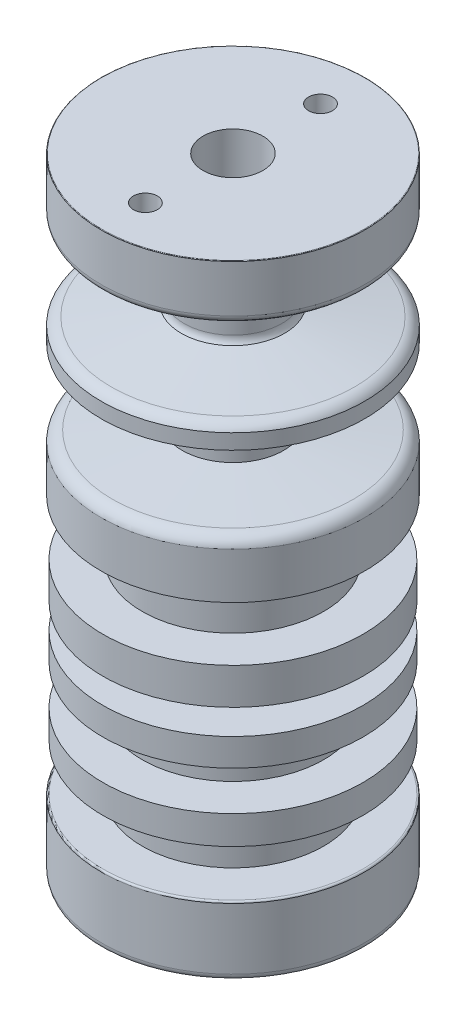
ISO-10303-21;
HEADER;
FILE_DESCRIPTION(('STEP AP214'),'2;1');
FILE_NAME('part.step','',(''),(''),'','','');
FILE_SCHEMA(('AUTOMOTIVE_DESIGN { 1 0 10303 214 1 1 1 1 }'));
ENDSEC;
DATA;
#1=APPLICATION_CONTEXT('core data for automotive mechanical design processes');
#2=APPLICATION_PROTOCOL_DEFINITION('international standard','automotive_design',2000,#1);
#3=PRODUCT_CONTEXT('',#1,'mechanical');
#4=PRODUCT('Part','Part','',(#3));
#5=PRODUCT_RELATED_PRODUCT_CATEGORY('part','',(#4));
#6=PRODUCT_DEFINITION_FORMATION('','',#4);
#7=PRODUCT_DEFINITION_CONTEXT('part definition',#1,'design');
#8=PRODUCT_DEFINITION('design','',#6,#7);
#9=PRODUCT_DEFINITION_SHAPE('','',#8);
#10=(LENGTH_UNIT() NAMED_UNIT(*) SI_UNIT(.MILLI.,.METRE.));
#11=(NAMED_UNIT(*) PLANE_ANGLE_UNIT() SI_UNIT($,.RADIAN.));
#12=(NAMED_UNIT(*) SI_UNIT($,.STERADIAN.) SOLID_ANGLE_UNIT());
#13=UNCERTAINTY_MEASURE_WITH_UNIT(LENGTH_MEASURE(1.E-05),#10,'distance_accuracy_value','');
#14=(GEOMETRIC_REPRESENTATION_CONTEXT(3) GLOBAL_UNCERTAINTY_ASSIGNED_CONTEXT((#13)) GLOBAL_UNIT_ASSIGNED_CONTEXT((#10,
#11,#12)) REPRESENTATION_CONTEXT('',''));
#15=CARTESIAN_POINT('',(0.,0.,0.));
#16=DIRECTION('',(0.,0.,1.));
#17=DIRECTION('',(1.,0.,0.));
#18=AXIS2_PLACEMENT_3D('',#15,#16,#17);
#19=CARTESIAN_POINT('',(0.,43.0445682451364,0.));
#20=DIRECTION('',(0.,-1.,0.));
#21=DIRECTION('',(1.,0.,0.));
#22=AXIS2_PLACEMENT_3D('',#19,#20,#21);
#23=PLANE('',#22);
#24=CARTESIAN_POINT('',(0.,43.0445682451364,0.));
#25=DIRECTION('',(0.,1.,0.));
#26=DIRECTION('',(0.,0.,1.));
#27=AXIS2_PLACEMENT_3D('',#24,#25,#26);
#28=CIRCLE('',#27,7.9375);
#29=CARTESIAN_POINT('',(0.,43.0445682451364,7.9375));
#30=VERTEX_POINT('',#29);
#31=EDGE_CURVE('E157',#30,#30,#28,.T.);
#32=ORIENTED_EDGE('',*,*,#31,.F.);
#33=EDGE_LOOP('',(#32));
#34=FACE_BOUND('',#33,.T.);
#35=CARTESIAN_POINT('',(0.244873021628365,43.0445682451364,-23.));
#36=DIRECTION('',(0.,1.,0.));
#37=DIRECTION('',(0.,0.,1.));
#38=AXIS2_PLACEMENT_3D('',#35,#36,#37);
#39=CIRCLE('',#38,3.175);
#40=CARTESIAN_POINT('',(0.244873021628365,43.0445682451364,-19.825));
#41=VERTEX_POINT('',#40);
#42=EDGE_CURVE('E148',#41,#41,#39,.T.);
#43=ORIENTED_EDGE('',*,*,#42,.F.);
#44=EDGE_LOOP('',(#43));
#45=FACE_BOUND('',#44,.T.);
#46=CARTESIAN_POINT('',(-0.244873021628365,43.0445682451364,23.));
#47=DIRECTION('',(0.,1.,0.));
#48=DIRECTION('',(0.,0.,1.));
#49=AXIS2_PLACEMENT_3D('',#46,#47,#48);
#50=CIRCLE('',#49,3.175);
#51=CARTESIAN_POINT('',(-0.244873021628365,43.0445682451364,26.175));
#52=VERTEX_POINT('',#51);
#53=EDGE_CURVE('E142',#52,#52,#50,.T.);
#54=ORIENTED_EDGE('',*,*,#53,.F.);
#55=EDGE_LOOP('',(#54));
#56=FACE_BOUND('',#55,.T.);
#57=CARTESIAN_POINT('',(0.,43.0445682451364,0.));
#58=DIRECTION('',(0.,1.,0.));
#59=DIRECTION('',(-1.,0.,0.));
#60=AXIS2_PLACEMENT_3D('',#57,#58,#59);
#61=CIRCLE('',#60,34.8584196821975);
#62=CARTESIAN_POINT('',(-34.8584196821975,43.0445682451364,0.));
#63=VERTEX_POINT('',#62);
#64=EDGE_CURVE('E10',#63,#63,#61,.T.);
#65=ORIENTED_EDGE('',*,*,#64,.T.);
#66=EDGE_LOOP('',(#65));
#67=FACE_BOUND('',#66,.T.);
#68=ADVANCED_FACE('F31',(#34,#45,#56,#67),#23,.F.);
#69=CARTESIAN_POINT('',(0.,42.9029879273339,0.));
#70=DIRECTION('',(0.,1.,0.));
#71=DIRECTION('',(-1.,0.,0.));
#72=AXIS2_PLACEMENT_3D('',#69,#70,#71);
#73=TOROIDAL_SURFACE('',#72,34.8584196821975,0.141580317802481);
#74=ORIENTED_EDGE('',*,*,#64,.F.);
#75=EDGE_LOOP('',(#74));
#76=FACE_BOUND('',#75,.T.);
#77=CARTESIAN_POINT('',(0.,42.9029879273339,0.));
#78=DIRECTION('',(0.,1.,0.));
#79=DIRECTION('',(-1.,0.,0.));
#80=AXIS2_PLACEMENT_3D('',#77,#78,#79);
#81=CIRCLE('',#80,35.);
#82=CARTESIAN_POINT('',(-35.,42.9029879273339,0.));
#83=VERTEX_POINT('',#82);
#84=EDGE_CURVE('E42',#83,#83,#81,.T.);
#85=ORIENTED_EDGE('',*,*,#84,.T.);
#86=EDGE_LOOP('',(#85));
#87=FACE_BOUND('',#86,.T.);
#88=ADVANCED_FACE('F174',(#76,#87),#73,.T.);
#89=CARTESIAN_POINT('',(0.,43.0445682451364,0.));
#90=DIRECTION('',(0.,1.,0.));
#91=DIRECTION('',(-1.,0.,0.));
#92=AXIS2_PLACEMENT_3D('',#89,#90,#91);
#93=CYLINDRICAL_SURFACE('',#92,35.);
#94=ORIENTED_EDGE('',*,*,#84,.F.);
#95=EDGE_LOOP('',(#94));
#96=FACE_BOUND('',#95,.T.);
#97=CARTESIAN_POINT('',(0.,30.3660149299546,0.));
#98=DIRECTION('',(0.,1.,0.));
#99=DIRECTION('',(-1.,0.,0.));
#100=AXIS2_PLACEMENT_3D('',#97,#98,#99);
#101=CIRCLE('',#100,35.);
#102=CARTESIAN_POINT('',(-35.,30.3660149299546,0.));
#103=VERTEX_POINT('',#102);
#104=EDGE_CURVE('E46',#103,#103,#101,.T.);
#105=ORIENTED_EDGE('',*,*,#104,.T.);
#106=EDGE_LOOP('',(#105));
#107=FACE_BOUND('',#106,.T.);
#108=ADVANCED_FACE('F316',(#96,#107),#93,.T.);
#109=CARTESIAN_POINT('',(0.,30.3660149299546,0.));
#110=DIRECTION('',(0.,1.,0.));
#111=DIRECTION('',(-1.,0.,0.));
#112=AXIS2_PLACEMENT_3D('',#109,#110,#111);
#113=TOROIDAL_SURFACE('',#112,32.9643531045201,2.03564689547988);
#114=ORIENTED_EDGE('',*,*,#104,.F.);
#115=EDGE_LOOP('',(#114));
#116=FACE_BOUND('',#115,.T.);
#117=CARTESIAN_POINT('',(0.,28.3303680344748,0.));
#118=DIRECTION('',(0.,1.,0.));
#119=DIRECTION('',(-1.,0.,0.));
#120=AXIS2_PLACEMENT_3D('',#117,#118,#119);
#121=CIRCLE('',#120,32.9643531045201);
#122=CARTESIAN_POINT('',(-32.9643531045201,28.3303680344747,0.));
#123=VERTEX_POINT('',#122);
#124=EDGE_CURVE('E51',#123,#123,#121,.T.);
#125=ORIENTED_EDGE('',*,*,#124,.T.);
#126=EDGE_LOOP('',(#125));
#127=FACE_BOUND('',#126,.T.);
#128=ADVANCED_FACE('F312',(#116,#127),#113,.T.);
#129=CARTESIAN_POINT('',(32.9643531045201,28.3303680344748,0.));
#130=DIRECTION('',(0.,1.,0.));
#131=DIRECTION('',(-1.,0.,0.));
#132=AXIS2_PLACEMENT_3D('',#129,#130,#131);
#133=PLANE('',#132);
#134=ORIENTED_EDGE('',*,*,#124,.F.);
#135=EDGE_LOOP('',(#134));
#136=FACE_BOUND('',#135,.T.);
#137=CARTESIAN_POINT('',(0.,28.3303680344748,0.));
#138=DIRECTION('',(0.,1.,0.));
#139=DIRECTION('',(-1.,0.,0.));
#140=AXIS2_PLACEMENT_3D('',#137,#138,#139);
#141=CIRCLE('',#140,12.9857969124329);
#142=CARTESIAN_POINT('',(-12.9857969124329,28.3303680344748,0.));
#143=VERTEX_POINT('',#142);
#144=EDGE_CURVE('E54',#143,#143,#141,.T.);
#145=ORIENTED_EDGE('',*,*,#144,.T.);
#146=EDGE_LOOP('',(#145));
#147=FACE_BOUND('',#146,.T.);
#148=ADVANCED_FACE('F308',(#136,#147),#133,.F.);
#149=CARTESIAN_POINT('',(0.,43.0445682451364,0.));
#150=DIRECTION('',(0.,1.,0.));
#151=DIRECTION('',(-1.,0.,0.));
#152=AXIS2_PLACEMENT_3D('',#149,#150,#151);
#153=CYLINDRICAL_SURFACE('',#152,12.9857969124329);
#154=ORIENTED_EDGE('',*,*,#144,.F.);
#155=EDGE_LOOP('',(#154));
#156=FACE_BOUND('',#155,.T.);
#157=CARTESIAN_POINT('',(0.,10.4062076007876,0.));
#158=DIRECTION('',(0.,1.,0.));
#159=DIRECTION('',(-1.,0.,0.));
#160=AXIS2_PLACEMENT_3D('',#157,#158,#159);
#161=CIRCLE('',#160,12.9857969124329);
#162=CARTESIAN_POINT('',(-12.9857969124329,10.4062076007876,0.));
#163=VERTEX_POINT('',#162);
#164=EDGE_CURVE('E57',#163,#163,#161,.T.);
#165=ORIENTED_EDGE('',*,*,#164,.T.);
#166=EDGE_LOOP('',(#165));
#167=FACE_BOUND('',#166,.T.);
#168=ADVANCED_FACE('F304',(#156,#167),#153,.T.);
#169=CARTESIAN_POINT('',(0.,10.4062076007876,0.));
#170=DIRECTION('',(0.,1.,0.));
#171=DIRECTION('',(-1.,0.,0.));
#172=AXIS2_PLACEMENT_3D('',#169,#170,#171);
#173=TOROIDAL_SURFACE('',#172,15.8008154382432,2.81501852581031);
#174=ORIENTED_EDGE('',*,*,#164,.F.);
#175=EDGE_LOOP('',(#174));
#176=FACE_BOUND('',#175,.T.);
#177=CARTESIAN_POINT('',(0.,8.51251271153448,0.));
#178=DIRECTION('',(0.,1.,0.));
#179=DIRECTION('',(-1.,0.,0.));
#180=AXIS2_PLACEMENT_3D('',#177,#178,#179);
#181=CIRCLE('',#180,13.7179690763931);
#182=CARTESIAN_POINT('',(-13.7179690763931,8.51251271153447,0.));
#183=VERTEX_POINT('',#182);
#184=EDGE_CURVE('E60',#183,#183,#181,.T.);
#185=ORIENTED_EDGE('',*,*,#184,.T.);
#186=EDGE_LOOP('',(#185));
#187=FACE_BOUND('',#186,.T.);
#188=ADVANCED_FACE('F300',(#176,#187),#173,.F.);
#189=CARTESIAN_POINT('',(0.,5.48596194522862,0.));
#190=DIRECTION('',(0.,-1.,0.));
#191=DIRECTION('',(1.,0.,0.));
#192=AXIS2_PLACEMENT_3D('',#189,#190,#191);
#193=CONICAL_SURFACE('',#192,32.3097448153254,1.40942212691776);
#194=ORIENTED_EDGE('',*,*,#184,.F.);
#195=EDGE_LOOP('',(#194));
#196=FACE_BOUND('',#195,.T.);
#197=CARTESIAN_POINT('',(0.,5.48596194522862,0.));
#198=DIRECTION('',(0.,1.,0.));
#199=DIRECTION('',(-1.,0.,0.));
#200=AXIS2_PLACEMENT_3D('',#197,#198,#199);
#201=CIRCLE('',#200,32.3097448153254);
#202=CARTESIAN_POINT('',(-32.3097448153254,5.48596194522862,0.));
#203=VERTEX_POINT('',#202);
#204=EDGE_CURVE('E63',#203,#203,#201,.T.);
#205=ORIENTED_EDGE('',*,*,#204,.T.);
#206=EDGE_LOOP('',(#205));
#207=FACE_BOUND('',#206,.T.);
#208=ADVANCED_FACE('F296',(#196,#207),#193,.T.);
#209=CARTESIAN_POINT('',(0.,1.82897337850735,0.));
#210=DIRECTION('',(0.,1.,0.));
#211=DIRECTION('',(-1.,0.,0.));
#212=AXIS2_PLACEMENT_3D('',#209,#210,#211);
#213=TOROIDAL_SURFACE('',#212,31.714424513252,3.7051277493753);
#214=ORIENTED_EDGE('',*,*,#204,.F.);
#215=EDGE_LOOP('',(#214));
#216=FACE_BOUND('',#215,.T.);
#217=CARTESIAN_POINT('',(0.,3.54156362724511,0.));
#218=DIRECTION('',(0.,1.,0.));
#219=DIRECTION('',(-1.,0.,0.));
#220=AXIS2_PLACEMENT_3D('',#217,#218,#219);
#221=CIRCLE('',#220,35.);
#222=CARTESIAN_POINT('',(-35.,3.54156362724511,0.));
#223=VERTEX_POINT('',#222);
#224=EDGE_CURVE('E66',#223,#223,#221,.T.);
#225=ORIENTED_EDGE('',*,*,#224,.T.);
#226=EDGE_LOOP('',(#225));
#227=FACE_BOUND('',#226,.T.);
#228=ADVANCED_FACE('F292',(#216,#227),#213,.T.);
#229=CARTESIAN_POINT('',(0.,43.0445682451364,0.));
#230=DIRECTION('',(0.,1.,0.));
#231=DIRECTION('',(-1.,0.,0.));
#232=AXIS2_PLACEMENT_3D('',#229,#230,#231);
#233=CYLINDRICAL_SURFACE('',#232,35.);
#234=ORIENTED_EDGE('',*,*,#224,.F.);
#235=EDGE_LOOP('',(#234));
#236=FACE_BOUND('',#235,.T.);
#237=CARTESIAN_POINT('',(0.,-0.490098714239634,0.));
#238=DIRECTION('',(0.,1.,0.));
#239=DIRECTION('',(-1.,0.,0.));
#240=AXIS2_PLACEMENT_3D('',#237,#238,#239);
#241=CIRCLE('',#240,35.);
#242=CARTESIAN_POINT('',(-35.,-0.490098714239638,0.));
#243=VERTEX_POINT('',#242);
#244=EDGE_CURVE('E69',#243,#243,#241,.T.);
#245=ORIENTED_EDGE('',*,*,#244,.T.);
#246=EDGE_LOOP('',(#245));
#247=FACE_BOUND('',#246,.T.);
#248=ADVANCED_FACE('F288',(#236,#247),#233,.T.);
#249=CARTESIAN_POINT('',(13.4687354882585,-0.490098714239631,0.));
#250=DIRECTION('',(0.,1.,0.));
#251=DIRECTION('',(-1.,0.,0.));
#252=AXIS2_PLACEMENT_3D('',#249,#250,#251);
#253=PLANE('',#252);
#254=ORIENTED_EDGE('',*,*,#244,.F.);
#255=EDGE_LOOP('',(#254));
#256=FACE_BOUND('',#255,.T.);
#257=CARTESIAN_POINT('',(0.,-0.490098714239634,0.));
#258=DIRECTION('',(0.,1.,0.));
#259=DIRECTION('',(-1.,0.,0.));
#260=AXIS2_PLACEMENT_3D('',#257,#258,#259);
#261=CIRCLE('',#260,13.4687354882585);
#262=CARTESIAN_POINT('',(-13.4687354882585,-0.490098714239636,0.));
#263=VERTEX_POINT('',#262);
#264=EDGE_CURVE('E72',#263,#263,#261,.T.);
#265=ORIENTED_EDGE('',*,*,#264,.T.);
#266=EDGE_LOOP('',(#265));
#267=FACE_BOUND('',#266,.T.);
#268=ADVANCED_FACE('F284',(#256,#267),#253,.F.);
#269=CARTESIAN_POINT('',(0.,43.0445682451364,0.));
#270=DIRECTION('',(0.,1.,0.));
#271=DIRECTION('',(-1.,0.,0.));
#272=AXIS2_PLACEMENT_3D('',#269,#270,#271);
#273=CYLINDRICAL_SURFACE('',#272,13.4687354882585);
#274=ORIENTED_EDGE('',*,*,#264,.F.);
#275=EDGE_LOOP('',(#274));
#276=FACE_BOUND('',#275,.T.);
#277=CARTESIAN_POINT('',(0.,-18.538757945872,0.));
#278=DIRECTION('',(0.,1.,0.));
#279=DIRECTION('',(-1.,0.,0.));
#280=AXIS2_PLACEMENT_3D('',#277,#278,#279);
#281=CIRCLE('',#280,13.4687354882585);
#282=CARTESIAN_POINT('',(-13.4687354882585,-18.538757945872,0.));
#283=VERTEX_POINT('',#282);
#284=EDGE_CURVE('E75',#283,#283,#281,.T.);
#285=ORIENTED_EDGE('',*,*,#284,.T.);
#286=EDGE_LOOP('',(#285));
#287=FACE_BOUND('',#286,.T.);
#288=ADVANCED_FACE('F280',(#276,#287),#273,.T.);
#289=CARTESIAN_POINT('',(0.,-20.5131962872159,0.));
#290=DIRECTION('',(0.,-1.,0.));
#291=DIRECTION('',(1.,0.,0.));
#292=AXIS2_PLACEMENT_3D('',#289,#290,#291);
#293=CONICAL_SURFACE('',#292,31.9792266270137,1.46453221422253);
#294=ORIENTED_EDGE('',*,*,#284,.F.);
#295=EDGE_LOOP('',(#294));
#296=FACE_BOUND('',#295,.T.);
#297=CARTESIAN_POINT('',(0.,-20.5131962872159,0.));
#298=DIRECTION('',(0.,1.,0.));
#299=DIRECTION('',(-1.,0.,0.));
#300=AXIS2_PLACEMENT_3D('',#297,#298,#299);
#301=CIRCLE('',#300,31.9792266270137);
#302=CARTESIAN_POINT('',(-31.9792266270137,-20.5131962872159,0.));
#303=VERTEX_POINT('',#302);
#304=EDGE_CURVE('E78',#303,#303,#301,.T.);
#305=ORIENTED_EDGE('',*,*,#304,.T.);
#306=EDGE_LOOP('',(#305));
#307=FACE_BOUND('',#306,.T.);
#308=ADVANCED_FACE('F276',(#296,#307),#293,.T.);
#309=CARTESIAN_POINT('',(0.,-23.9615059492109,0.));
#310=DIRECTION('',(0.,1.,0.));
#311=DIRECTION('',(-1.,0.,0.));
#312=AXIS2_PLACEMENT_3D('',#309,#310,#311);
#313=TOROIDAL_SURFACE('',#312,31.6114095465033,3.46787095055789);
#314=ORIENTED_EDGE('',*,*,#304,.F.);
#315=EDGE_LOOP('',(#314));
#316=FACE_BOUND('',#315,.T.);
#317=CARTESIAN_POINT('',(0.,-23.2242246811764,0.));
#318=DIRECTION('',(0.,1.,0.));
#319=DIRECTION('',(-1.,0.,0.));
#320=AXIS2_PLACEMENT_3D('',#317,#318,#319);
#321=CIRCLE('',#320,35.);
#322=CARTESIAN_POINT('',(-35.,-23.2242246811764,0.));
#323=VERTEX_POINT('',#322);
#324=EDGE_CURVE('E81',#323,#323,#321,.T.);
#325=ORIENTED_EDGE('',*,*,#324,.T.);
#326=EDGE_LOOP('',(#325));
#327=FACE_BOUND('',#326,.T.);
#328=ADVANCED_FACE('F272',(#316,#327),#313,.T.);
#329=CARTESIAN_POINT('',(0.,43.0445682451364,0.));
#330=DIRECTION('',(0.,1.,0.));
#331=DIRECTION('',(-1.,0.,0.));
#332=AXIS2_PLACEMENT_3D('',#329,#330,#331);
#333=CYLINDRICAL_SURFACE('',#332,35.);
#334=ORIENTED_EDGE('',*,*,#324,.F.);
#335=EDGE_LOOP('',(#334));
#336=FACE_BOUND('',#335,.T.);
#337=CARTESIAN_POINT('',(0.,-35.501069654203,0.));
#338=DIRECTION('',(0.,1.,0.));
#339=DIRECTION('',(-1.,0.,0.));
#340=AXIS2_PLACEMENT_3D('',#337,#338,#339);
#341=CIRCLE('',#340,35.);
#342=CARTESIAN_POINT('',(-35.,-35.501069654203,0.));
#343=VERTEX_POINT('',#342);
#344=EDGE_CURVE('E84',#343,#343,#341,.T.);
#345=ORIENTED_EDGE('',*,*,#344,.T.);
#346=EDGE_LOOP('',(#345));
#347=FACE_BOUND('',#346,.T.);
#348=ADVANCED_FACE('F268',(#336,#347),#333,.T.);
#349=CARTESIAN_POINT('',(35.,-35.501069654203,0.));
#350=DIRECTION('',(0.,1.,0.));
#351=DIRECTION('',(-1.,0.,0.));
#352=AXIS2_PLACEMENT_3D('',#349,#350,#351);
#353=PLANE('',#352);
#354=ORIENTED_EDGE('',*,*,#344,.F.);
#355=EDGE_LOOP('',(#354));
#356=FACE_BOUND('',#355,.T.);
#357=CARTESIAN_POINT('',(0.,-35.501069654203,0.));
#358=DIRECTION('',(0.,1.,0.));
#359=DIRECTION('',(-1.,0.,0.));
#360=AXIS2_PLACEMENT_3D('',#357,#358,#359);
#361=CIRCLE('',#360,24.0860533652923);
#362=CARTESIAN_POINT('',(-24.0860533652923,-35.501069654203,0.));
#363=VERTEX_POINT('',#362);
#364=EDGE_CURVE('E87',#363,#363,#361,.T.);
#365=ORIENTED_EDGE('',*,*,#364,.T.);
#366=EDGE_LOOP('',(#365));
#367=FACE_BOUND('',#366,.T.);
#368=ADVANCED_FACE('F264',(#356,#367),#353,.F.);
#369=CARTESIAN_POINT('',(0.,43.0445682451364,0.));
#370=DIRECTION('',(0.,1.,0.));
#371=DIRECTION('',(-1.,0.,0.));
#372=AXIS2_PLACEMENT_3D('',#369,#370,#371);
#373=CYLINDRICAL_SURFACE('',#372,24.0860533652923);
#374=ORIENTED_EDGE('',*,*,#364,.F.);
#375=EDGE_LOOP('',(#374));
#376=FACE_BOUND('',#375,.T.);
#377=CARTESIAN_POINT('',(0.,-50.2632732960367,0.));
#378=DIRECTION('',(0.,1.,0.));
#379=DIRECTION('',(-1.,0.,0.));
#380=AXIS2_PLACEMENT_3D('',#377,#378,#379);
#381=CIRCLE('',#380,24.0860533652923);
#382=CARTESIAN_POINT('',(-24.0860533652923,-50.2632732960367,0.));
#383=VERTEX_POINT('',#382);
#384=EDGE_CURVE('E90',#383,#383,#381,.T.);
#385=ORIENTED_EDGE('',*,*,#384,.T.);
#386=EDGE_LOOP('',(#385));
#387=FACE_BOUND('',#386,.T.);
#388=ADVANCED_FACE('F260',(#376,#387),#373,.T.);
#389=CARTESIAN_POINT('',(34.5383420831025,-50.2632732960367,0.));
#390=DIRECTION('',(0.,-1.,0.));
#391=DIRECTION('',(1.,0.,0.));
#392=AXIS2_PLACEMENT_3D('',#389,#390,#391);
#393=PLANE('',#392);
#394=ORIENTED_EDGE('',*,*,#384,.F.);
#395=EDGE_LOOP('',(#394));
#396=FACE_BOUND('',#395,.T.);
#397=CARTESIAN_POINT('',(0.,-50.2632732960367,0.));
#398=DIRECTION('',(0.,1.,0.));
#399=DIRECTION('',(-1.,0.,0.));
#400=AXIS2_PLACEMENT_3D('',#397,#398,#399);
#401=CIRCLE('',#400,34.5383420831025);
#402=CARTESIAN_POINT('',(-34.5383420831025,-50.2632732960367,0.));
#403=VERTEX_POINT('',#402);
#404=EDGE_CURVE('E93',#403,#403,#401,.T.);
#405=ORIENTED_EDGE('',*,*,#404,.T.);
#406=EDGE_LOOP('',(#405));
#407=FACE_BOUND('',#406,.T.);
#408=ADVANCED_FACE('F256',(#396,#407),#393,.F.);
#409=CARTESIAN_POINT('',(0.,43.0445682451364,0.));
#410=DIRECTION('',(0.,1.,0.));
#411=DIRECTION('',(-1.,0.,0.));
#412=AXIS2_PLACEMENT_3D('',#409,#410,#411);
#413=CYLINDRICAL_SURFACE('',#412,34.5383420831025);
#414=ORIENTED_EDGE('',*,*,#404,.F.);
#415=EDGE_LOOP('',(#414));
#416=FACE_BOUND('',#415,.T.);
#417=CARTESIAN_POINT('',(0.,-59.9179333119601,0.));
#418=DIRECTION('',(0.,1.,0.));
#419=DIRECTION('',(-1.,0.,0.));
#420=AXIS2_PLACEMENT_3D('',#417,#418,#419);
#421=CIRCLE('',#420,34.5383420831025);
#422=CARTESIAN_POINT('',(-34.5383420831025,-59.9179333119601,0.));
#423=VERTEX_POINT('',#422);
#424=EDGE_CURVE('E96',#423,#423,#421,.T.);
#425=ORIENTED_EDGE('',*,*,#424,.T.);
#426=EDGE_LOOP('',(#425));
#427=FACE_BOUND('',#426,.T.);
#428=ADVANCED_FACE('F252',(#416,#427),#413,.T.);
#429=CARTESIAN_POINT('',(24.0860533652924,-59.9179333119601,0.));
#430=DIRECTION('',(0.,1.,0.));
#431=DIRECTION('',(-1.,0.,0.));
#432=AXIS2_PLACEMENT_3D('',#429,#430,#431);
#433=PLANE('',#432);
#434=ORIENTED_EDGE('',*,*,#424,.F.);
#435=EDGE_LOOP('',(#434));
#436=FACE_BOUND('',#435,.T.);
#437=CARTESIAN_POINT('',(0.,-59.9179333119601,0.));
#438=DIRECTION('',(0.,1.,0.));
#439=DIRECTION('',(-1.,0.,0.));
#440=AXIS2_PLACEMENT_3D('',#437,#438,#439);
#441=CIRCLE('',#440,24.0860533652923);
#442=CARTESIAN_POINT('',(-24.0860533652923,-59.9179333119601,0.));
#443=VERTEX_POINT('',#442);
#444=EDGE_CURVE('E99',#443,#443,#441,.T.);
#445=ORIENTED_EDGE('',*,*,#444,.T.);
#446=EDGE_LOOP('',(#445));
#447=FACE_BOUND('',#446,.T.);
#448=ADVANCED_FACE('F248',(#436,#447),#433,.F.);
#449=CARTESIAN_POINT('',(0.,43.0445682451364,0.));
#450=DIRECTION('',(0.,1.,0.));
#451=DIRECTION('',(-1.,0.,0.));
#452=AXIS2_PLACEMENT_3D('',#449,#450,#451);
#453=CYLINDRICAL_SURFACE('',#452,24.0860533652923);
#454=ORIENTED_EDGE('',*,*,#444,.F.);
#455=EDGE_LOOP('',(#454));
#456=FACE_BOUND('',#455,.T.);
#457=CARTESIAN_POINT('',(0.,-66.6170851597436,0.));
#458=DIRECTION('',(0.,1.,0.));
#459=DIRECTION('',(-1.,0.,0.));
#460=AXIS2_PLACEMENT_3D('',#457,#458,#459);
#461=CIRCLE('',#460,24.0860533652923);
#462=CARTESIAN_POINT('',(-24.0860533652923,-66.6170851597436,0.));
#463=VERTEX_POINT('',#462);
#464=EDGE_CURVE('E102',#463,#463,#461,.T.);
#465=ORIENTED_EDGE('',*,*,#464,.T.);
#466=EDGE_LOOP('',(#465));
#467=FACE_BOUND('',#466,.T.);
#468=ADVANCED_FACE('F244',(#456,#467),#453,.T.);
#469=CARTESIAN_POINT('',(34.5383420831025,-66.6170851597436,0.));
#470=DIRECTION('',(0.,-1.,0.));
#471=DIRECTION('',(1.,0.,0.));
#472=AXIS2_PLACEMENT_3D('',#469,#470,#471);
#473=PLANE('',#472);
#474=ORIENTED_EDGE('',*,*,#464,.F.);
#475=EDGE_LOOP('',(#474));
#476=FACE_BOUND('',#475,.T.);
#477=CARTESIAN_POINT('',(0.,-66.6170851597436,0.));
#478=DIRECTION('',(0.,1.,0.));
#479=DIRECTION('',(-1.,0.,0.));
#480=AXIS2_PLACEMENT_3D('',#477,#478,#479);
#481=CIRCLE('',#480,34.5383420831025);
#482=CARTESIAN_POINT('',(-34.5383420831025,-66.6170851597436,0.));
#483=VERTEX_POINT('',#482);
#484=EDGE_CURVE('E105',#483,#483,#481,.T.);
#485=ORIENTED_EDGE('',*,*,#484,.T.);
#486=EDGE_LOOP('',(#485));
#487=FACE_BOUND('',#486,.T.);
#488=ADVANCED_FACE('F240',(#476,#487),#473,.F.);
#489=CARTESIAN_POINT('',(0.,43.0445682451364,0.));
#490=DIRECTION('',(0.,1.,0.));
#491=DIRECTION('',(-1.,0.,0.));
#492=AXIS2_PLACEMENT_3D('',#489,#490,#491);
#493=CYLINDRICAL_SURFACE('',#492,34.5383420831025);
#494=ORIENTED_EDGE('',*,*,#484,.F.);
#495=EDGE_LOOP('',(#494));
#496=FACE_BOUND('',#495,.T.);
#497=CARTESIAN_POINT('',(0.,-73.9073386411552,0.));
#498=DIRECTION('',(0.,1.,0.));
#499=DIRECTION('',(-1.,0.,0.));
#500=AXIS2_PLACEMENT_3D('',#497,#498,#499);
#501=CIRCLE('',#500,34.5383420831025);
#502=CARTESIAN_POINT('',(-34.5383420831025,-73.9073386411552,0.));
#503=VERTEX_POINT('',#502);
#504=EDGE_CURVE('E108',#503,#503,#501,.T.);
#505=ORIENTED_EDGE('',*,*,#504,.T.);
#506=EDGE_LOOP('',(#505));
#507=FACE_BOUND('',#506,.T.);
#508=ADVANCED_FACE('F236',(#496,#507),#493,.T.);
#509=CARTESIAN_POINT('',(24.0860533652924,-73.9073386411552,0.));
#510=DIRECTION('',(0.,1.,0.));
#511=DIRECTION('',(-1.,0.,0.));
#512=AXIS2_PLACEMENT_3D('',#509,#510,#511);
#513=PLANE('',#512);
#514=ORIENTED_EDGE('',*,*,#504,.F.);
#515=EDGE_LOOP('',(#514));
#516=FACE_BOUND('',#515,.T.);
#517=CARTESIAN_POINT('',(0.,-73.9073386411552,0.));
#518=DIRECTION('',(0.,1.,0.));
#519=DIRECTION('',(-1.,0.,0.));
#520=AXIS2_PLACEMENT_3D('',#517,#518,#519);
#521=CIRCLE('',#520,24.0860533652923);
#522=CARTESIAN_POINT('',(-24.0860533652923,-73.9073386411552,0.));
#523=VERTEX_POINT('',#522);
#524=EDGE_CURVE('E111',#523,#523,#521,.T.);
#525=ORIENTED_EDGE('',*,*,#524,.T.);
#526=EDGE_LOOP('',(#525));
#527=FACE_BOUND('',#526,.T.);
#528=ADVANCED_FACE('F232',(#516,#527),#513,.F.);
#529=CARTESIAN_POINT('',(0.,43.0445682451364,0.));
#530=DIRECTION('',(0.,1.,0.));
#531=DIRECTION('',(-1.,0.,0.));
#532=AXIS2_PLACEMENT_3D('',#529,#530,#531);
#533=CYLINDRICAL_SURFACE('',#532,24.0860533652923);
#534=ORIENTED_EDGE('',*,*,#524,.F.);
#535=EDGE_LOOP('',(#534));
#536=FACE_BOUND('',#535,.T.);
#537=CARTESIAN_POINT('',(0.,-84.3501341685825,0.));
#538=DIRECTION('',(0.,1.,0.));
#539=DIRECTION('',(-1.,0.,0.));
#540=AXIS2_PLACEMENT_3D('',#537,#538,#539);
#541=CIRCLE('',#540,24.0860533652923);
#542=CARTESIAN_POINT('',(-24.0860533652923,-84.3501341685825,0.));
#543=VERTEX_POINT('',#542);
#544=EDGE_CURVE('E114',#543,#543,#541,.T.);
#545=ORIENTED_EDGE('',*,*,#544,.T.);
#546=EDGE_LOOP('',(#545));
#547=FACE_BOUND('',#546,.T.);
#548=ADVANCED_FACE('F228',(#536,#547),#533,.T.);
#549=CARTESIAN_POINT('',(34.5383420831025,-84.3501341685825,0.));
#550=DIRECTION('',(0.,-1.,0.));
#551=DIRECTION('',(1.,0.,0.));
#552=AXIS2_PLACEMENT_3D('',#549,#550,#551);
#553=PLANE('',#552);
#554=ORIENTED_EDGE('',*,*,#544,.F.);
#555=EDGE_LOOP('',(#554));
#556=FACE_BOUND('',#555,.T.);
#557=CARTESIAN_POINT('',(0.,-84.3501341685825,0.));
#558=DIRECTION('',(0.,1.,0.));
#559=DIRECTION('',(-1.,0.,0.));
#560=AXIS2_PLACEMENT_3D('',#557,#558,#559);
#561=CIRCLE('',#560,34.5383420831025);
#562=CARTESIAN_POINT('',(-34.5383420831025,-84.3501341685825,0.));
#563=VERTEX_POINT('',#562);
#564=EDGE_CURVE('E117',#563,#563,#561,.T.);
#565=ORIENTED_EDGE('',*,*,#564,.T.);
#566=EDGE_LOOP('',(#565));
#567=FACE_BOUND('',#566,.T.);
#568=ADVANCED_FACE('F224',(#556,#567),#553,.F.);
#569=CARTESIAN_POINT('',(0.,43.0445682451364,0.));
#570=DIRECTION('',(0.,1.,0.));
#571=DIRECTION('',(-1.,0.,0.));
#572=AXIS2_PLACEMENT_3D('',#569,#570,#571);
#573=CYLINDRICAL_SURFACE('',#572,34.5383420831025);
#574=ORIENTED_EDGE('',*,*,#564,.F.);
#575=EDGE_LOOP('',(#574));
#576=FACE_BOUND('',#575,.T.);
#577=CARTESIAN_POINT('',(0.,-91.9233816601069,0.));
#578=DIRECTION('',(0.,1.,0.));
#579=DIRECTION('',(-1.,0.,0.));
#580=AXIS2_PLACEMENT_3D('',#577,#578,#579);
#581=CIRCLE('',#580,34.5383420831025);
#582=CARTESIAN_POINT('',(-34.5383420831025,-91.9233816601069,0.));
#583=VERTEX_POINT('',#582);
#584=EDGE_CURVE('E120',#583,#583,#581,.T.);
#585=ORIENTED_EDGE('',*,*,#584,.T.);
#586=EDGE_LOOP('',(#585));
#587=FACE_BOUND('',#586,.T.);
#588=ADVANCED_FACE('F220',(#576,#587),#573,.T.);
#589=CARTESIAN_POINT('',(24.0860533652924,-91.9233816601069,0.));
#590=DIRECTION('',(0.,1.,0.));
#591=DIRECTION('',(-1.,0.,0.));
#592=AXIS2_PLACEMENT_3D('',#589,#590,#591);
#593=PLANE('',#592);
#594=ORIENTED_EDGE('',*,*,#584,.F.);
#595=EDGE_LOOP('',(#594));
#596=FACE_BOUND('',#595,.T.);
#597=CARTESIAN_POINT('',(0.,-91.9233816601069,0.));
#598=DIRECTION('',(0.,1.,0.));
#599=DIRECTION('',(-1.,0.,0.));
#600=AXIS2_PLACEMENT_3D('',#597,#598,#599);
#601=CIRCLE('',#600,24.0860533652923);
#602=CARTESIAN_POINT('',(-24.0860533652923,-91.9233816601069,0.));
#603=VERTEX_POINT('',#602);
#604=EDGE_CURVE('E123',#603,#603,#601,.T.);
#605=ORIENTED_EDGE('',*,*,#604,.T.);
#606=EDGE_LOOP('',(#605));
#607=FACE_BOUND('',#606,.T.);
#608=ADVANCED_FACE('F216',(#596,#607),#593,.F.);
#609=CARTESIAN_POINT('',(0.,43.0445682451364,0.));
#610=DIRECTION('',(0.,1.,0.));
#611=DIRECTION('',(-1.,0.,0.));
#612=AXIS2_PLACEMENT_3D('',#609,#610,#611);
#613=CYLINDRICAL_SURFACE('',#612,24.0860533652923);
#614=ORIENTED_EDGE('',*,*,#604,.F.);
#615=EDGE_LOOP('',(#614));
#616=FACE_BOUND('',#615,.T.);
#617=CARTESIAN_POINT('',(0.,-104.221668073603,0.));
#618=DIRECTION('',(0.,1.,0.));
#619=DIRECTION('',(-1.,0.,0.));
#620=AXIS2_PLACEMENT_3D('',#617,#618,#619);
#621=CIRCLE('',#620,24.0860533652923);
#622=CARTESIAN_POINT('',(-24.0860533652923,-104.221668073603,0.));
#623=VERTEX_POINT('',#622);
#624=EDGE_CURVE('E126',#623,#623,#621,.T.);
#625=ORIENTED_EDGE('',*,*,#624,.T.);
#626=EDGE_LOOP('',(#625));
#627=FACE_BOUND('',#626,.T.);
#628=ADVANCED_FACE('F212',(#616,#627),#613,.T.);
#629=CARTESIAN_POINT('',(24.0860533652924,-104.221668073603,0.));
#630=DIRECTION('',(0.,-1.,0.));
#631=DIRECTION('',(1.,0.,0.));
#632=AXIS2_PLACEMENT_3D('',#629,#630,#631);
#633=PLANE('',#632);
#634=ORIENTED_EDGE('',*,*,#624,.F.);
#635=EDGE_LOOP('',(#634));
#636=FACE_BOUND('',#635,.T.);
#637=CARTESIAN_POINT('',(0.,-104.221668073603,0.));
#638=DIRECTION('',(0.,1.,0.));
#639=DIRECTION('',(-1.,0.,0.));
#640=AXIS2_PLACEMENT_3D('',#637,#638,#639);
#641=CIRCLE('',#640,34.5383420831025);
#642=CARTESIAN_POINT('',(-34.5383420831024,-104.221668073603,0.));
#643=VERTEX_POINT('',#642);
#644=EDGE_CURVE('E129',#643,#643,#641,.T.);
#645=ORIENTED_EDGE('',*,*,#644,.T.);
#646=EDGE_LOOP('',(#645));
#647=FACE_BOUND('',#646,.T.);
#648=ADVANCED_FACE('F208',(#636,#647),#633,.F.);
#649=CARTESIAN_POINT('',(0.,-104.683325990501,0.));
#650=DIRECTION('',(0.,1.,0.));
#651=DIRECTION('',(-1.,0.,0.));
#652=AXIS2_PLACEMENT_3D('',#649,#650,#651);
#653=TOROIDAL_SURFACE('',#652,34.5383420831025,0.461657916897524);
#654=ORIENTED_EDGE('',*,*,#644,.F.);
#655=EDGE_LOOP('',(#654));
#656=FACE_BOUND('',#655,.T.);
#657=CARTESIAN_POINT('',(0.,-104.683325990501,0.));
#658=DIRECTION('',(0.,1.,0.));
#659=DIRECTION('',(-1.,0.,0.));
#660=AXIS2_PLACEMENT_3D('',#657,#658,#659);
#661=CIRCLE('',#660,35.);
#662=CARTESIAN_POINT('',(-35.,-104.683325990501,0.));
#663=VERTEX_POINT('',#662);
#664=EDGE_CURVE('E132',#663,#663,#661,.T.);
#665=ORIENTED_EDGE('',*,*,#664,.T.);
#666=EDGE_LOOP('',(#665));
#667=FACE_BOUND('',#666,.T.);
#668=ADVANCED_FACE('F204',(#656,#667),#653,.T.);
#669=CARTESIAN_POINT('',(0.,43.0445682451364,0.));
#670=DIRECTION('',(0.,1.,0.));
#671=DIRECTION('',(-1.,0.,0.));
#672=AXIS2_PLACEMENT_3D('',#669,#670,#671);
#673=CYLINDRICAL_SURFACE('',#672,35.);
#674=ORIENTED_EDGE('',*,*,#664,.F.);
#675=EDGE_LOOP('',(#674));
#676=FACE_BOUND('',#675,.T.);
#677=CARTESIAN_POINT('',(0.,-120.950877142593,0.));
#678=DIRECTION('',(0.,1.,0.));
#679=DIRECTION('',(-1.,0.,0.));
#680=AXIS2_PLACEMENT_3D('',#677,#678,#679);
#681=CIRCLE('',#680,35.);
#682=CARTESIAN_POINT('',(-35.,-120.950877142593,0.));
#683=VERTEX_POINT('',#682);
#684=EDGE_CURVE('E135',#683,#683,#681,.T.);
#685=ORIENTED_EDGE('',*,*,#684,.T.);
#686=EDGE_LOOP('',(#685));
#687=FACE_BOUND('',#686,.T.);
#688=ADVANCED_FACE('F200',(#676,#687),#673,.T.);
#689=CARTESIAN_POINT('',(0.,-120.950877142593,0.));
#690=DIRECTION('',(0.,1.,0.));
#691=DIRECTION('',(-1.,0.,0.));
#692=AXIS2_PLACEMENT_3D('',#689,#690,#691);
#693=TOROIDAL_SURFACE('',#692,32.8057667062163,2.19423329378374);
#694=ORIENTED_EDGE('',*,*,#684,.F.);
#695=EDGE_LOOP('',(#694));
#696=FACE_BOUND('',#695,.T.);
#697=CARTESIAN_POINT('',(0.,-121.991013624139,0.));
#698=DIRECTION('',(0.,1.,0.));
#699=DIRECTION('',(-1.,0.,0.));
#700=AXIS2_PLACEMENT_3D('',#697,#698,#699);
#701=CIRCLE('',#700,34.7378060037741);
#702=CARTESIAN_POINT('',(-34.737806003774,-121.991013624139,0.));
#703=VERTEX_POINT('',#702);
#704=EDGE_CURVE('E138',#703,#703,#701,.T.);
#705=ORIENTED_EDGE('',*,*,#704,.T.);
#706=EDGE_LOOP('',(#705));
#707=FACE_BOUND('',#706,.T.);
#708=ADVANCED_FACE('F192',(#696,#707),#693,.T.);
#709=CARTESIAN_POINT('',(0.,-121.955431754864,0.));
#710=DIRECTION('',(0.,-1.,0.));
#711=DIRECTION('',(1.,0.,0.));
#712=AXIS2_PLACEMENT_3D('',#709,#710,#711);
#713=CONICAL_SURFACE('',#712,0.,1.56977202903622);
#714=CARTESIAN_POINT('',(-6.36106018007291,-121.963480691199,-4.6135782172158));
#715=CARTESIAN_POINT('',(-6.49068148751279,-121.963479036223,-4.43211114299382));
#716=CARTESIAN_POINT('',(-6.61263417878172,-121.963477478649,-4.24519875533849));
#717=CARTESIAN_POINT('',(-6.84041092831941,-121.96347456876,-3.86170975929556));
#718=CARTESIAN_POINT('',(-6.94623073450214,-121.963473216499,-3.66513062107115));
#719=CARTESIAN_POINT('',(-7.14104386483969,-121.963470726471,-3.26354844807968));
#720=CARTESIAN_POINT('',(-7.23001908349345,-121.963469588936,-3.0585366341877));
#721=CARTESIAN_POINT('',(-7.39037347236735,-121.963467538478,-2.64173939408541));
#722=CARTESIAN_POINT('',(-7.46175243062228,-121.963466625558,-2.42995388631362));
#723=CARTESIAN_POINT('',(-7.58637331864399,-121.963465031483,-2.00122566551518));
#724=CARTESIAN_POINT('',(-7.63962415539972,-121.963464350215,-1.78428554135136));
#725=CARTESIAN_POINT('',(-7.72765957924456,-121.963463223833,-1.3466865609368));
#726=CARTESIAN_POINT('',(-7.76244387471223,-121.963462778723,-1.12602764601613));
#727=CARTESIAN_POINT('',(-7.81328657341241,-121.963462128101,-0.68265915392948));
#728=CARTESIAN_POINT('',(-7.82935301903827,-121.963461922485,-0.459950498951601));
#729=CARTESIAN_POINT('',(-7.84267522066424,-121.963461751991,-0.0138940048602957));
#730=CARTESIAN_POINT('',(-7.83992446350051,-121.963461787196,0.20945402881971));
#731=CARTESIAN_POINT('',(-7.81561738851114,-121.963462098268,0.655107356290028));
#732=CARTESIAN_POINT('',(-7.79406250013239,-121.963462374116,0.877412728049693));
#733=CARTESIAN_POINT('',(-7.73230185550378,-121.963463164422,1.31942097040223));
#734=CARTESIAN_POINT('',(-7.69209580798168,-121.963463678883,1.53912380029666));
#735=CARTESIAN_POINT('',(-7.59331756765714,-121.963464942633,1.97436594207252));
#736=CARTESIAN_POINT('',(-7.53474499875824,-121.963465691927,2.18990516859872));
#737=CARTESIAN_POINT('',(-7.39964889254357,-121.963467419838,2.61528781984506));
#738=CARTESIAN_POINT('',(-7.32312495872387,-121.96346839846,2.82513111864116));
#739=CARTESIAN_POINT('',(-7.15268822269617,-121.96347057759,3.23758310569089));
#740=CARTESIAN_POINT('',(-7.05877894974961,-121.963471778054,3.44019325235017));
#741=CARTESIAN_POINT('',(-6.85419322916782,-121.963474392629,3.83685254282162));
#742=CARTESIAN_POINT('',(-6.7435109875797,-121.963475806814,4.03089869831602));
#743=CARTESIAN_POINT('',(-6.50621208338016,-121.963478837861,4.4089406245625));
#744=CARTESIAN_POINT('',(-6.37959833805512,-121.963480454686,4.59293822652526));
#745=CARTESIAN_POINT('',(-6.11131856716454,-121.963483879394,4.94961604223365));
#746=CARTESIAN_POINT('',(-5.96965230731195,-121.963485687279,5.12229607975775));
#747=CARTESIAN_POINT('',(-5.67227884125356,-121.963489480827,5.45510512136233));
#748=CARTESIAN_POINT('',(-5.5165718727258,-121.963491466488,5.61523433781463));
#749=CARTESIAN_POINT('',(-5.19221829381684,-121.963495601163,5.92180999292121));
#750=CARTESIAN_POINT('',(-5.02357139751166,-121.963497750183,6.06825612907195));
#751=CARTESIAN_POINT('',(-4.67457251084223,-121.963502195473,6.34639454905067));
#752=CARTESIAN_POINT('',(-4.49422270275033,-121.963504491716,6.47808957114227));
#753=CARTESIAN_POINT('',(-4.12300724577775,-121.963509215955,6.72586413270371));
#754=CARTESIAN_POINT('',(-3.93213797760384,-121.963511643996,6.84193824981818));
#755=CARTESIAN_POINT('',(-3.54133345298982,-121.963516613057,7.05757221414336));
#756=CARTESIAN_POINT('',(-3.3413998388534,-121.963519154056,7.15713503781065));
#757=CARTESIAN_POINT('',(-2.93385277802333,-121.963524331121,7.33906547449058));
#758=CARTESIAN_POINT('',(-2.7262392118201,-121.963526967188,7.42143281978762));
#759=CARTESIAN_POINT('',(-2.30481499032204,-121.963532315312,7.56838343372556));
#760=CARTESIAN_POINT('',(-2.09100444526215,-121.963535027368,7.63296701849848));
#761=CARTESIAN_POINT('',(-1.65869795623633,-121.963540508094,7.74389414295753));
#762=CARTESIAN_POINT('',(-1.44020190881316,-121.963543276767,7.79023727945116));
#763=CARTESIAN_POINT('',(-1.00012308362754,-121.963548850326,7.86434515303795));
#764=CARTESIAN_POINT('',(-0.778540882682177,-121.963551655206,7.89211331555146));
#765=CARTESIAN_POINT('',(-0.333747926527271,-121.96355728264,7.92889395915511));
#766=CARTESIAN_POINT('',(-0.110536634022487,-121.9635601052,7.93789994309731));
#767=CARTESIAN_POINT('',(0.335810523091959,-121.963565746424,7.93707287840004));
#768=CARTESIAN_POINT('',(0.558946394040125,-121.963568565089,7.92724324390474));
#769=CARTESIAN_POINT('',(1.0036003874378,-121.963574179082,7.88882128709381));
#770=CARTESIAN_POINT('',(1.22511848465228,-121.963576974411,7.86022867273106));
#771=CARTESIAN_POINT('',(1.66495438356983,-121.963582521865,7.78448446072182));
#772=CARTESIAN_POINT('',(1.88327224502939,-121.963585273991,7.73733321007101));
#773=CARTESIAN_POINT('',(2.31516464208103,-121.963590715749,7.62480566437409));
#774=CARTESIAN_POINT('',(2.52873907272666,-121.96359340538,7.55942896653028));
#775=CARTESIAN_POINT('',(2.94958236863661,-121.963598702687,7.41092947929695));
#776=CARTESIAN_POINT('',(3.15685238765801,-121.963601310379,7.32780995958142));
#777=CARTESIAN_POINT('',(3.5637255049126,-121.963606426942,7.1443765632267));
#778=CARTESIAN_POINT('',(3.76332592191611,-121.963608935778,7.04405673925697));
#779=CARTESIAN_POINT('',(4.15329397860059,-121.963613835247,6.82699530393895));
#780=CARTESIAN_POINT('',(4.34366491886751,-121.963616225922,6.71025962225243));
#781=CARTESIAN_POINT('',(4.71396749495767,-121.963620874247,6.46112206615792));
#782=CARTESIAN_POINT('',(4.89389519684446,-121.963623131848,6.32871434449348));
#783=CARTESIAN_POINT('',(5.24188226900823,-121.963627496445,6.0492672966569));
#784=CARTESIAN_POINT('',(5.40994651726058,-121.963629603504,5.90223404478273));
#785=CARTESIAN_POINT('',(5.73316755565324,-121.963633654354,5.59446523804266));
#786=CARTESIAN_POINT('',(5.88831846220152,-121.963635598071,5.43372350410186));
#787=CARTESIAN_POINT('',(6.18452418501628,-121.963639307709,5.09973845099629));
#788=CARTESIAN_POINT('',(6.32557900128369,-121.963641073631,4.92649513183233));
#789=CARTESIAN_POINT('',(6.59252875428198,-121.963644414717,4.56882026912154));
#790=CARTESIAN_POINT('',(6.7184305287382,-121.963645989968,4.38439382882208));
#791=CARTESIAN_POINT('',(6.95430259796647,-121.963648940397,4.00551387173824));
#792=CARTESIAN_POINT('',(7.06426627917942,-121.963650315492,3.8110562376033));
#793=CARTESIAN_POINT('',(7.26737992966675,-121.963652854885,3.41364163710357));
#794=CARTESIAN_POINT('',(7.36053617430167,-121.963654019262,3.21068787793602));
#795=CARTESIAN_POINT('',(7.5294540245506,-121.963656130232,2.79758073471913));
#796=CARTESIAN_POINT('',(7.60520934865629,-121.963657076746,2.58742478213256));
#797=CARTESIAN_POINT('',(7.73872037921748,-121.963658744661,2.1615511516767));
#798=CARTESIAN_POINT('',(7.79648231073161,-121.96365946614,1.94583542531409));
#799=CARTESIAN_POINT('',(7.89364063071995,-121.963660679592,1.51026518041947));
#800=CARTESIAN_POINT('',(7.9330336350998,-121.963661171523,1.2904099070174));
#801=CARTESIAN_POINT('',(7.99315762390745,-121.963661922303,0.848167216740394));
#802=CARTESIAN_POINT('',(8.01388902078591,-121.963662181157,0.625779855938561));
#803=CARTESIAN_POINT('',(8.03654411944145,-121.963662464029,0.180045013131348));
#804=CARTESIAN_POINT('',(8.03846746956955,-121.963662488042,-0.0433024867473856));
#805=CARTESIAN_POINT('',(8.02349200475022,-121.96366230106,-0.489362074713133));
#806=CARTESIAN_POINT('',(8.00659348277304,-121.963662090068,-0.712074172636346));
#807=CARTESIAN_POINT('',(7.95409010166877,-121.963661434465,-1.1553233842834));
#808=CARTESIAN_POINT('',(7.91848185209247,-121.963660989812,-1.37586009641693));
#809=CARTESIAN_POINT('',(7.82882578879867,-121.963659870108,-1.8130732936738));
#810=CARTESIAN_POINT('',(7.77478436150633,-121.963659195136,-2.0297510884502));
#811=CARTESIAN_POINT('',(7.64863159832715,-121.96365761924,-2.45782448123256));
#812=CARTESIAN_POINT('',(7.57651693046351,-121.963656718276,-2.66921909732173));
#813=CARTESIAN_POINT('',(7.41473716819372,-121.963654696666,-3.08517707102213));
#814=CARTESIAN_POINT('',(7.3250724617325,-121.963653576026,-3.28974057951852));
#815=CARTESIAN_POINT('',(7.12882730201068,-121.963651122733,-3.69059054478591));
#816=CARTESIAN_POINT('',(7.02224654805184,-121.963649790076,-3.8868768543436));
#817=CARTESIAN_POINT('',(6.79292997888041,-121.963646921959,-4.26977005309285));
#818=CARTESIAN_POINT('',(6.67019441518837,-121.963645386501,-4.4563770929217));
#819=CARTESIAN_POINT('',(6.40941591352122,-121.963642123055,-4.81862114888375));
#820=CARTESIAN_POINT('',(6.27137021660913,-121.963640395031,-4.99425617888075));
#821=CARTESIAN_POINT('',(5.98102159054563,-121.963636759243,-5.33321166887344));
#822=CARTESIAN_POINT('',(5.82872361252217,-121.963634851542,-5.49653637004269));
#823=CARTESIAN_POINT('',(5.51088278020568,-121.96363086872,-5.80980687435621));
#824=CARTESIAN_POINT('',(5.34533746797384,-121.963628793567,-5.9597501837208));
#825=CARTESIAN_POINT('',(5.00220741230084,-121.963624490585,-6.24515453081358));
#826=CARTESIAN_POINT('',(4.82462293503771,-121.96362226276,-6.38061588855765));
#827=CARTESIAN_POINT('',(4.45867065674479,-121.963617669838,-6.63609928628065));
#828=CARTESIAN_POINT('',(4.27030267325793,-121.963615304738,-6.75612106491006));
#829=CARTESIAN_POINT('',(3.88412835626727,-121.963610453819,-6.97986756569865));
#830=CARTESIAN_POINT('',(3.68632216973293,-121.963607968,-7.08359254151987));
#831=CARTESIAN_POINT('',(3.2826379971085,-121.96360289251,-7.27402771876677));
#832=CARTESIAN_POINT('',(3.07675854144739,-121.963600302819,-7.36073480502737));
#833=CARTESIAN_POINT('',(2.65849854489206,-121.96359503907,-7.51646689897941));
#834=CARTESIAN_POINT('',(2.44612027871706,-121.963592365042,-7.58549801613772));
#835=CARTESIAN_POINT('',(2.01626042878946,-121.963586949998,-7.70543896854089));
#836=CARTESIAN_POINT('',(1.79877781871229,-121.963584208968,-7.7563451255657));
#837=CARTESIAN_POINT('',(1.36030201414843,-121.963578679819,-7.83965374909822));
#838=CARTESIAN_POINT('',(1.1393088973141,-121.963575891702,-7.87205662431408));
#839=CARTESIAN_POINT('',(0.695383065087287,-121.963570288084,-7.91812959107193));
#840=CARTESIAN_POINT('',(0.472450389506973,-121.963567472585,-7.93180006621404));
#841=CARTESIAN_POINT('',(0.0262293604267968,-121.963561834153,-7.94031222121078));
#842=CARTESIAN_POINT('',(-0.197058987464026,-121.96355901122,-7.93515419511374));
#843=CARTESIAN_POINT('',(-0.642424465511042,-121.963553377739,-7.90604555058042));
#844=CARTESIAN_POINT('',(-0.864501502303984,-121.963550567192,-7.88209350362015));
#845=CARTESIAN_POINT('',(-1.30577173806636,-121.963544979721,-7.81557691884477));
#846=CARTESIAN_POINT('',(-1.52496590832822,-121.963542202786,-7.77301882430138));
#847=CARTESIAN_POINT('',(-1.95908486798955,-121.963536700224,-7.66957159769274));
#848=CARTESIAN_POINT('',(-2.17400778099124,-121.963533974621,-7.60867459100667));
#849=CARTESIAN_POINT('',(-2.59795518325467,-121.963528595568,-7.46899029098743));
#850=CARTESIAN_POINT('',(-2.8069797656058,-121.963525942117,-7.39020328017787));
#851=CARTESIAN_POINT('',(-3.21774912245832,-121.963520725146,-7.21525532060628));
#852=CARTESIAN_POINT('',(-3.41949026253196,-121.963518161671,-7.11908583793579));
#853=CARTESIAN_POINT('',(-3.81414505326807,-121.9635131446,-6.91008568103312));
#854=CARTESIAN_POINT('',(-4.00705881023107,-121.963510691004,-6.79725520750402));
#855=CARTESIAN_POINT('',(-4.38249076304705,-121.96350591396,-6.555860828378));
#856=CARTESIAN_POINT('',(-4.56501983818954,-121.963503590377,-6.42731384977915));
#857=CARTESIAN_POINT('',(-4.91855007670776,-121.963499088132,-6.15535350666611));
#858=CARTESIAN_POINT('',(-5.08955425979278,-121.963496909433,-6.01194406154804));
#859=CARTESIAN_POINT('',(-5.45989951512373,-121.963492189229,-5.67377792985477));
#860=CARTESIAN_POINT('',(-5.65570228864336,-121.963489692361,-5.4751243982424));
#861=CARTESIAN_POINT('',(-6.02534352409369,-121.963484976758,-5.05833755671391));
#862=CARTESIAN_POINT('',(-6.19918198602438,-121.963482758023,-4.84020424679778));
#863=CARTESIAN_POINT('',(-6.36106018007291,-121.963480691199,-4.6135782172158));
#864=B_SPLINE_CURVE_WITH_KNOTS('',3,(#714,#715,#716,#717,#718,#719,#720,#721,#722,#723,#724,
#725,#726,#727,#728,#729,#730,#731,#732,#733,#734,#735,#736,#737,#738,#739,#740,#741,#742,#743,
#744,#745,#746,#747,#748,#749,#750,#751,#752,#753,#754,#755,#756,#757,#758,#759,#760,#761,#762,
#763,#764,#765,#766,#767,#768,#769,#770,#771,#772,#773,#774,#775,#776,#777,#778,#779,#780,#781,
#782,#783,#784,#785,#786,#787,#788,#789,#790,#791,#792,#793,#794,#795,#796,#797,#798,#799,#800,
#801,#802,#803,#804,#805,#806,#807,#808,#809,#810,#811,#812,#813,#814,#815,#816,#817,#818,#819,
#820,#821,#822,#823,#824,#825,#826,#827,#828,#829,#830,#831,#832,#833,#834,#835,#836,#837,#838,
#839,#840,#841,#842,#843,#844,#845,#846,#847,#848,#849,#850,#851,#852,#853,#854,#855,#856,#857,
#858,#859,#860,#861,#862,#863),.UNSPECIFIED.,.T.,.F.,(4,2,2,2,2,2,2,2,2,2,2,2,2,2,2,2,2,2,2,2,2,
2,2,2,2,2,2,2,2,2,2,2,2,2,2,2,2,2,2,2,2,2,2,2,2,2,2,2,2,2,2,2,2,2,2,2,2,2,2,2,2,2,2,2,2,2,2,2,2,
2,2,2,2,2,4),(0.,0.668776788790052,1.33772954105242,2.00739728867246,2.67707310274173,
3.34641940483328,4.01577627684796,4.68484544386598,5.35414620628105,6.02339609442215,
6.69265643448613,7.36193048007836,8.03121930977111,8.7003724210726,9.36975720970537,
10.039019602296,10.7082924132448,11.3775538970159,12.0468301732226,12.7159820044029,
13.3853655168673,14.0546282294783,14.7239013610321,15.3931625945214,16.0624386207374,
16.7315911913733,17.4009754441166,18.0702383757481,18.739511724752,19.4087725607714,
20.0780481891905,20.7472005887979,21.4165848288357,22.0857278950624,22.7551214110252,
23.4242380651014,24.093657932783,24.7630778004209,25.4321944544533,26.1015879703719,
26.7707310365544,27.4401152764799,28.1092676759748,28.7785433042812,29.447804140188,
30.1170774890601,30.7863404205598,31.4557246731714,32.1248772436756,32.7941532697982,
33.4634145031943,34.132687634655,34.8019503471731,35.4713338596235,36.1404856907899,
36.809761966983,37.4790234507407,38.1482962617608,38.817558654423,39.4869434431275,
40.1560965545008,40.825385384319,41.4946594300367,42.1639197702262,42.8331696584928,
43.5024704210322,44.1715395881745,44.8408964603136,45.5102427625295,46.1799185767151,
46.8495863244513,47.5185390768293,48.1873158657348,49.0225209792237,49.8577260927126),.UNSPECIFIED.);
#865=CARTESIAN_POINT('',(-6.36106018007291,-121.963480691199,-4.6135782172158));
#866=VERTEX_POINT('',#865);
#867=EDGE_CURVE('E34',#866,#866,#864,.T.);
#868=ORIENTED_EDGE('',*,*,#867,.T.);
#869=EDGE_LOOP('',(#868));
#870=FACE_BOUND('',#869,.T.);
#871=ORIENTED_EDGE('',*,*,#704,.F.);
#872=EDGE_LOOP('',(#871));
#873=FACE_BOUND('',#872,.T.);
#874=ADVANCED_FACE('F182',(#870,#873),#713,.F.);
#875=CARTESIAN_POINT('',(-0.244873021628365,31.0445682451364,23.));
#876=DIRECTION('',(0.,1.,0.));
#877=DIRECTION('',(0.,0.,1.));
#878=AXIS2_PLACEMENT_3D('',#875,#876,#877);
#879=CYLINDRICAL_SURFACE('',#878,3.175);
#880=CARTESIAN_POINT('',(-0.244873021628365,31.0445682451364,23.));
#881=DIRECTION('',(0.,1.,0.));
#882=DIRECTION('',(0.,0.,1.));
#883=AXIS2_PLACEMENT_3D('',#880,#881,#882);
#884=CIRCLE('',#883,3.175);
#885=CARTESIAN_POINT('',(-0.244873021628365,31.0445682451364,26.175));
#886=VERTEX_POINT('',#885);
#887=EDGE_CURVE('E141',#886,#886,#884,.T.);
#888=ORIENTED_EDGE('',*,*,#887,.F.);
#889=EDGE_LOOP('',(#888));
#890=FACE_BOUND('',#889,.T.);
#891=ORIENTED_EDGE('',*,*,#53,.T.);
#892=EDGE_LOOP('',(#891));
#893=FACE_BOUND('',#892,.T.);
#894=ADVANCED_FACE('F179',(#890,#893),#879,.F.);
#895=CARTESIAN_POINT('',(-0.244873021628365,31.0445682451364,23.));
#896=DIRECTION('',(0.,1.,0.));
#897=DIRECTION('',(0.,0.,1.));
#898=AXIS2_PLACEMENT_3D('',#895,#896,#897);
#899=PLANE('',#898);
#900=ORIENTED_EDGE('',*,*,#887,.T.);
#901=EDGE_LOOP('',(#900));
#902=FACE_BOUND('',#901,.T.);
#903=ADVANCED_FACE('F181',(#902),#899,.T.);
#904=CARTESIAN_POINT('',(0.244873021628365,31.0445682451364,-23.));
#905=DIRECTION('',(0.,1.,0.));
#906=DIRECTION('',(0.,0.,1.));
#907=AXIS2_PLACEMENT_3D('',#904,#905,#906);
#908=CYLINDRICAL_SURFACE('',#907,3.175);
#909=CARTESIAN_POINT('',(0.244873021628365,31.0445682451364,-23.));
#910=DIRECTION('',(0.,1.,0.));
#911=DIRECTION('',(0.,0.,1.));
#912=AXIS2_PLACEMENT_3D('',#909,#910,#911);
#913=CIRCLE('',#912,3.175);
#914=CARTESIAN_POINT('',(0.244873021628365,31.0445682451364,-19.825));
#915=VERTEX_POINT('',#914);
#916=EDGE_CURVE('E145',#915,#915,#913,.T.);
#917=ORIENTED_EDGE('',*,*,#916,.F.);
#918=EDGE_LOOP('',(#917));
#919=FACE_BOUND('',#918,.T.);
#920=ORIENTED_EDGE('',*,*,#42,.T.);
#921=EDGE_LOOP('',(#920));
#922=FACE_BOUND('',#921,.T.);
#923=ADVANCED_FACE('F189',(#919,#922),#908,.F.);
#924=CARTESIAN_POINT('',(0.244873021628365,31.0445682451364,-23.));
#925=DIRECTION('',(0.,1.,0.));
#926=DIRECTION('',(0.,0.,1.));
#927=AXIS2_PLACEMENT_3D('',#924,#925,#926);
#928=PLANE('',#927);
#929=ORIENTED_EDGE('',*,*,#916,.T.);
#930=EDGE_LOOP('',(#929));
#931=FACE_BOUND('',#930,.T.);
#932=ADVANCED_FACE('F526',(#931),#928,.T.);
#933=CARTESIAN_POINT('',(0.0979492086516378,-122.221668073603,0.));
#934=DIRECTION('',(0.,1.,0.));
#935=DIRECTION('',(0.,0.,1.));
#936=AXIS2_PLACEMENT_3D('',#933,#934,#935);
#937=CYLINDRICAL_SURFACE('',#936,7.9375);
#938=CARTESIAN_POINT('',(0.0979492086516378,-104.221668073603,0.));
#939=DIRECTION('',(0.,1.,0.));
#940=DIRECTION('',(0.,0.,1.));
#941=AXIS2_PLACEMENT_3D('',#938,#939,#940);
#942=CIRCLE('',#941,7.9375);
#943=CARTESIAN_POINT('',(0.0979492086516378,-104.221668073603,7.9375));
#944=VERTEX_POINT('',#943);
#945=EDGE_CURVE('E153',#944,#944,#942,.T.);
#946=ORIENTED_EDGE('',*,*,#945,.T.);
#947=EDGE_LOOP('',(#946));
#948=FACE_BOUND('',#947,.T.);
#949=ORIENTED_EDGE('',*,*,#867,.F.);
#950=EDGE_LOOP('',(#949));
#951=FACE_BOUND('',#950,.T.);
#952=ADVANCED_FACE('F531',(#948,#951),#937,.F.);
#953=CARTESIAN_POINT('',(0.0979492086516378,-104.221668073603,0.));
#954=DIRECTION('',(0.,1.,0.));
#955=DIRECTION('',(0.,0.,1.));
#956=AXIS2_PLACEMENT_3D('',#953,#954,#955);
#957=PLANE('',#956);
#958=ORIENTED_EDGE('',*,*,#945,.F.);
#959=EDGE_LOOP('',(#958));
#960=FACE_BOUND('',#959,.T.);
#961=ADVANCED_FACE('F168',(#960),#957,.F.);
#962=CARTESIAN_POINT('',(0.,31.0445682451364,0.));
#963=DIRECTION('',(0.,1.,0.));
#964=DIRECTION('',(0.,0.,1.));
#965=AXIS2_PLACEMENT_3D('',#962,#963,#964);
#966=CYLINDRICAL_SURFACE('',#965,7.9375);
#967=CARTESIAN_POINT('',(0.,31.0445682451364,0.));
#968=DIRECTION('',(0.,1.,0.));
#969=DIRECTION('',(0.,0.,1.));
#970=AXIS2_PLACEMENT_3D('',#967,#968,#969);
#971=CIRCLE('',#970,7.9375);
#972=CARTESIAN_POINT('',(0.,31.0445682451364,7.9375));
#973=VERTEX_POINT('',#972);
#974=EDGE_CURVE('E156',#973,#973,#971,.T.);
#975=ORIENTED_EDGE('',*,*,#974,.F.);
#976=EDGE_LOOP('',(#975));
#977=FACE_BOUND('',#976,.T.);
#978=ORIENTED_EDGE('',*,*,#31,.T.);
#979=EDGE_LOOP('',(#978));
#980=FACE_BOUND('',#979,.T.);
#981=ADVANCED_FACE('F165',(#977,#980),#966,.F.);
#982=CARTESIAN_POINT('',(0.,31.0445682451364,0.));
#983=DIRECTION('',(0.,1.,0.));
#984=DIRECTION('',(0.,0.,1.));
#985=AXIS2_PLACEMENT_3D('',#982,#983,#984);
#986=PLANE('',#985);
#987=ORIENTED_EDGE('',*,*,#974,.T.);
#988=EDGE_LOOP('',(#987));
#989=FACE_BOUND('',#988,.T.);
#990=ADVANCED_FACE('F163',(#989),#986,.T.);
#991=CLOSED_SHELL('',(#68,#88,#108,#128,#148,#168,#188,#208,#228,#248,#268,#288,#308,#328,#348,
#368,#388,#408,#428,#448,#468,#488,#508,#528,#548,#568,#588,#608,#628,#648,#668,#688,#708,#874,
#894,#903,#923,#932,#952,#961,#981,#990));
#992=MANIFOLD_SOLID_BREP('B2',#991);
#993=ADVANCED_BREP_SHAPE_REPRESENTATION('',(#18,#992),#14);
#994=SHAPE_DEFINITION_REPRESENTATION(#9,#993);
ENDSEC;
END-ISO-10303-21;
